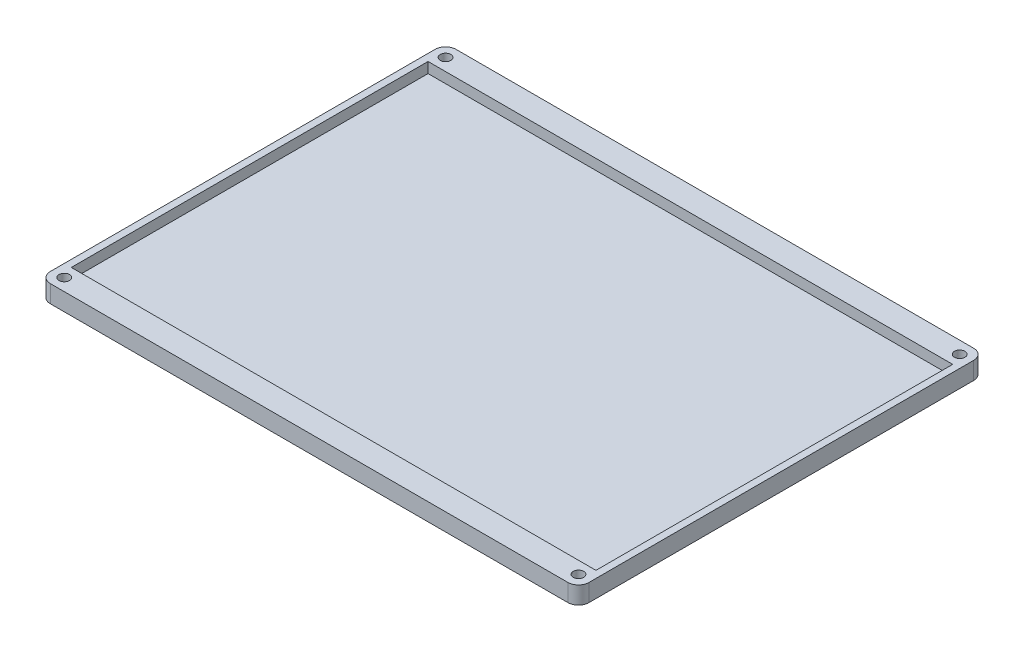
ISO-10303-21;
HEADER;
FILE_DESCRIPTION(('STEP AP214'),'2;1');
FILE_NAME('part.step','',(''),(''),'','','');
FILE_SCHEMA(('AUTOMOTIVE_DESIGN { 1 0 10303 214 1 1 1 1 }'));
ENDSEC;
DATA;
#1=APPLICATION_CONTEXT('core data for automotive mechanical design processes');
#2=APPLICATION_PROTOCOL_DEFINITION('international standard','automotive_design',2000,#1);
#3=PRODUCT_CONTEXT('',#1,'mechanical');
#4=PRODUCT('Part','Part','',(#3));
#5=PRODUCT_RELATED_PRODUCT_CATEGORY('part','',(#4));
#6=PRODUCT_DEFINITION_FORMATION('','',#4);
#7=PRODUCT_DEFINITION_CONTEXT('part definition',#1,'design');
#8=PRODUCT_DEFINITION('design','',#6,#7);
#9=PRODUCT_DEFINITION_SHAPE('','',#8);
#10=(LENGTH_UNIT() NAMED_UNIT(*) SI_UNIT(.MILLI.,.METRE.));
#11=(NAMED_UNIT(*) PLANE_ANGLE_UNIT() SI_UNIT($,.RADIAN.));
#12=(NAMED_UNIT(*) SI_UNIT($,.STERADIAN.) SOLID_ANGLE_UNIT());
#13=UNCERTAINTY_MEASURE_WITH_UNIT(LENGTH_MEASURE(1.E-05),#10,'distance_accuracy_value','');
#14=(GEOMETRIC_REPRESENTATION_CONTEXT(3) GLOBAL_UNCERTAINTY_ASSIGNED_CONTEXT((#13)) GLOBAL_UNIT_ASSIGNED_CONTEXT((#10,
#11,#12)) REPRESENTATION_CONTEXT('',''));
#15=CARTESIAN_POINT('',(0.,0.,0.));
#16=DIRECTION('',(0.,0.,1.));
#17=DIRECTION('',(1.,0.,0.));
#18=AXIS2_PLACEMENT_3D('',#15,#16,#17);
#19=CARTESIAN_POINT('',(74.,5.,-55.));
#20=DIRECTION('',(0.,1.,0.));
#21=DIRECTION('',(0.,0.,1.));
#22=AXIS2_PLACEMENT_3D('',#19,#20,#21);
#23=CYLINDRICAL_SURFACE('',#22,3.);
#24=DIRECTION('',(0.,1.,0.));
#25=VECTOR('',#24,1.);
#26=CARTESIAN_POINT('',(77.,5.,-55.));
#27=LINE('',#26,#25);
#28=CARTESIAN_POINT('',(77.,0.,-55.));
#29=VERTEX_POINT('',#28);
#30=CARTESIAN_POINT('',(77.,5.,-55.));
#31=VERTEX_POINT('',#30);
#32=EDGE_CURVE('E253',#29,#31,#27,.T.);
#33=ORIENTED_EDGE('',*,*,#32,.F.);
#34=CARTESIAN_POINT('',(74.,0.,-55.));
#35=DIRECTION('',(0.,1.,0.));
#36=DIRECTION('',(0.,0.,1.));
#37=AXIS2_PLACEMENT_3D('',#34,#35,#36);
#38=CIRCLE('',#37,3.);
#39=CARTESIAN_POINT('',(74.,0.,-58.));
#40=VERTEX_POINT('',#39);
#41=EDGE_CURVE('E47',#40,#29,#38,.F.);
#42=ORIENTED_EDGE('',*,*,#41,.F.);
#43=DIRECTION('',(0.,1.,0.));
#44=VECTOR('',#43,1.);
#45=CARTESIAN_POINT('',(74.,5.,-58.));
#46=LINE('',#45,#44);
#47=CARTESIAN_POINT('',(74.,5.,-58.));
#48=VERTEX_POINT('',#47);
#49=EDGE_CURVE('E257',#48,#40,#46,.F.);
#50=ORIENTED_EDGE('',*,*,#49,.F.);
#51=CARTESIAN_POINT('',(74.,5.,-55.));
#52=DIRECTION('',(0.,1.,0.));
#53=DIRECTION('',(0.,0.,1.));
#54=AXIS2_PLACEMENT_3D('',#51,#52,#53);
#55=CIRCLE('',#54,3.);
#56=EDGE_CURVE('E11',#31,#48,#55,.T.);
#57=ORIENTED_EDGE('',*,*,#56,.F.);
#58=EDGE_LOOP('',(#33,#42,#50,#57));
#59=FACE_BOUND('',#58,.T.);
#60=ADVANCED_FACE('F39',(#59),#23,.T.);
#61=CARTESIAN_POINT('',(-74.,5.,-55.));
#62=DIRECTION('',(0.,1.,0.));
#63=DIRECTION('',(0.,0.,1.));
#64=AXIS2_PLACEMENT_3D('',#61,#62,#63);
#65=CYLINDRICAL_SURFACE('',#64,3.);
#66=DIRECTION('',(0.,1.,0.));
#67=VECTOR('',#66,1.);
#68=CARTESIAN_POINT('',(-74.,5.,-58.));
#69=LINE('',#68,#67);
#70=CARTESIAN_POINT('',(-74.,0.,-58.));
#71=VERTEX_POINT('',#70);
#72=CARTESIAN_POINT('',(-74.,5.,-58.));
#73=VERTEX_POINT('',#72);
#74=EDGE_CURVE('E238',#71,#73,#69,.T.);
#75=ORIENTED_EDGE('',*,*,#74,.F.);
#76=CARTESIAN_POINT('',(-74.,0.,-55.));
#77=DIRECTION('',(0.,1.,0.));
#78=DIRECTION('',(0.,0.,1.));
#79=AXIS2_PLACEMENT_3D('',#76,#77,#78);
#80=CIRCLE('',#79,3.);
#81=CARTESIAN_POINT('',(-77.,0.,-55.));
#82=VERTEX_POINT('',#81);
#83=EDGE_CURVE('E246',#82,#71,#80,.F.);
#84=ORIENTED_EDGE('',*,*,#83,.F.);
#85=DIRECTION('',(0.,1.,0.));
#86=VECTOR('',#85,1.);
#87=CARTESIAN_POINT('',(-77.,5.,-55.));
#88=LINE('',#87,#86);
#89=CARTESIAN_POINT('',(-77.,5.,-55.));
#90=VERTEX_POINT('',#89);
#91=EDGE_CURVE('E242',#90,#82,#88,.F.);
#92=ORIENTED_EDGE('',*,*,#91,.F.);
#93=CARTESIAN_POINT('',(-74.,5.,-55.));
#94=DIRECTION('',(0.,1.,0.));
#95=DIRECTION('',(0.,0.,1.));
#96=AXIS2_PLACEMENT_3D('',#93,#94,#95);
#97=CIRCLE('',#96,3.);
#98=EDGE_CURVE('E250',#73,#90,#97,.T.);
#99=ORIENTED_EDGE('',*,*,#98,.F.);
#100=EDGE_LOOP('',(#75,#84,#92,#99));
#101=FACE_BOUND('',#100,.T.);
#102=ADVANCED_FACE('F289',(#101),#65,.T.);
#103=CARTESIAN_POINT('',(-74.,5.,55.));
#104=DIRECTION('',(0.,-1.,0.));
#105=DIRECTION('',(0.,0.,-1.));
#106=AXIS2_PLACEMENT_3D('',#103,#104,#105);
#107=CYLINDRICAL_SURFACE('',#106,3.);
#108=DIRECTION('',(0.,-1.,0.));
#109=VECTOR('',#108,1.);
#110=CARTESIAN_POINT('',(-74.,5.,58.));
#111=LINE('',#110,#109);
#112=CARTESIAN_POINT('',(-74.,5.,58.));
#113=VERTEX_POINT('',#112);
#114=CARTESIAN_POINT('',(-74.,0.,58.));
#115=VERTEX_POINT('',#114);
#116=EDGE_CURVE('E223',#113,#115,#111,.T.);
#117=ORIENTED_EDGE('',*,*,#116,.F.);
#118=CARTESIAN_POINT('',(-74.,5.,55.));
#119=DIRECTION('',(0.,1.,0.));
#120=DIRECTION('',(0.,0.,1.));
#121=AXIS2_PLACEMENT_3D('',#118,#119,#120);
#122=CIRCLE('',#121,3.);
#123=CARTESIAN_POINT('',(-77.,5.,55.));
#124=VERTEX_POINT('',#123);
#125=EDGE_CURVE('E231',#124,#113,#122,.T.);
#126=ORIENTED_EDGE('',*,*,#125,.F.);
#127=DIRECTION('',(0.,-1.,0.));
#128=VECTOR('',#127,1.);
#129=CARTESIAN_POINT('',(-77.,5.,55.));
#130=LINE('',#129,#128);
#131=CARTESIAN_POINT('',(-77.,0.,55.));
#132=VERTEX_POINT('',#131);
#133=EDGE_CURVE('E227',#132,#124,#130,.F.);
#134=ORIENTED_EDGE('',*,*,#133,.F.);
#135=CARTESIAN_POINT('',(-74.,0.,55.));
#136=DIRECTION('',(0.,1.,0.));
#137=DIRECTION('',(0.,0.,1.));
#138=AXIS2_PLACEMENT_3D('',#135,#136,#137);
#139=CIRCLE('',#138,3.);
#140=EDGE_CURVE('E234',#115,#132,#139,.F.);
#141=ORIENTED_EDGE('',*,*,#140,.F.);
#142=EDGE_LOOP('',(#117,#126,#134,#141));
#143=FACE_BOUND('',#142,.T.);
#144=ADVANCED_FACE('F281',(#143),#107,.T.);
#145=CARTESIAN_POINT('',(74.,5.,55.));
#146=DIRECTION('',(0.,-1.,0.));
#147=DIRECTION('',(0.,0.,-1.));
#148=AXIS2_PLACEMENT_3D('',#145,#146,#147);
#149=CYLINDRICAL_SURFACE('',#148,3.);
#150=DIRECTION('',(0.,-1.,0.));
#151=VECTOR('',#150,1.);
#152=CARTESIAN_POINT('',(77.,5.,55.));
#153=LINE('',#152,#151);
#154=CARTESIAN_POINT('',(77.,5.,55.));
#155=VERTEX_POINT('',#154);
#156=CARTESIAN_POINT('',(77.,0.,55.));
#157=VERTEX_POINT('',#156);
#158=EDGE_CURVE('E197',#155,#157,#153,.T.);
#159=ORIENTED_EDGE('',*,*,#158,.F.);
#160=CARTESIAN_POINT('',(74.,5.,55.));
#161=DIRECTION('',(0.,1.,0.));
#162=DIRECTION('',(0.,0.,1.));
#163=AXIS2_PLACEMENT_3D('',#160,#161,#162);
#164=CIRCLE('',#163,3.);
#165=CARTESIAN_POINT('',(73.9999999999999,5.,58.));
#166=VERTEX_POINT('',#165);
#167=EDGE_CURVE('E216',#166,#155,#164,.T.);
#168=ORIENTED_EDGE('',*,*,#167,.F.);
#169=DIRECTION('',(0.,-1.,0.));
#170=VECTOR('',#169,1.);
#171=CARTESIAN_POINT('',(74.,5.,58.));
#172=LINE('',#171,#170);
#173=CARTESIAN_POINT('',(73.9999999999999,0.,58.));
#174=VERTEX_POINT('',#173);
#175=EDGE_CURVE('E212',#174,#166,#172,.F.);
#176=ORIENTED_EDGE('',*,*,#175,.F.);
#177=CARTESIAN_POINT('',(74.,0.,55.));
#178=DIRECTION('',(0.,1.,0.));
#179=DIRECTION('',(0.,0.,1.));
#180=AXIS2_PLACEMENT_3D('',#177,#178,#179);
#181=CIRCLE('',#180,3.);
#182=EDGE_CURVE('E219',#157,#174,#181,.F.);
#183=ORIENTED_EDGE('',*,*,#182,.F.);
#184=EDGE_LOOP('',(#159,#168,#176,#183));
#185=FACE_BOUND('',#184,.T.);
#186=ADVANCED_FACE('F270',(#185),#149,.T.);
#187=CARTESIAN_POINT('',(77.,5.,-58.));
#188=DIRECTION('',(-1.,0.,0.));
#189=DIRECTION('',(0.,0.,1.));
#190=AXIS2_PLACEMENT_3D('',#187,#188,#189);
#191=PLANE('',#190);
#192=DIRECTION('',(0.,0.,-1.));
#193=VECTOR('',#192,1.);
#194=CARTESIAN_POINT('',(77.,0.,-58.));
#195=LINE('',#194,#193);
#196=EDGE_CURVE('E178',#157,#29,#195,.T.);
#197=ORIENTED_EDGE('',*,*,#196,.T.);
#198=ORIENTED_EDGE('',*,*,#32,.T.);
#199=DIRECTION('',(0.,0.,-1.));
#200=VECTOR('',#199,1.);
#201=CARTESIAN_POINT('',(77.,5.,-58.));
#202=LINE('',#201,#200);
#203=EDGE_CURVE('E184',#155,#31,#202,.T.);
#204=ORIENTED_EDGE('',*,*,#203,.F.);
#205=ORIENTED_EDGE('',*,*,#158,.T.);
#206=EDGE_LOOP('',(#197,#198,#204,#205));
#207=FACE_BOUND('',#206,.T.);
#208=ADVANCED_FACE('F266',(#207),#191,.F.);
#209=CARTESIAN_POINT('',(-77.,5.,-58.));
#210=DIRECTION('',(0.,0.,1.));
#211=DIRECTION('',(1.,0.,0.));
#212=AXIS2_PLACEMENT_3D('',#209,#210,#211);
#213=PLANE('',#212);
#214=DIRECTION('',(-1.,0.,0.));
#215=VECTOR('',#214,1.);
#216=CARTESIAN_POINT('',(-77.,5.,-58.));
#217=LINE('',#216,#215);
#218=EDGE_CURVE('E187',#48,#73,#217,.T.);
#219=ORIENTED_EDGE('',*,*,#218,.F.);
#220=ORIENTED_EDGE('',*,*,#49,.T.);
#221=DIRECTION('',(-1.,0.,0.));
#222=VECTOR('',#221,1.);
#223=CARTESIAN_POINT('',(-77.,0.,-58.));
#224=LINE('',#223,#222);
#225=EDGE_CURVE('E201',#40,#71,#224,.T.);
#226=ORIENTED_EDGE('',*,*,#225,.T.);
#227=ORIENTED_EDGE('',*,*,#74,.T.);
#228=EDGE_LOOP('',(#219,#220,#226,#227));
#229=FACE_BOUND('',#228,.T.);
#230=ADVANCED_FACE('F292',(#229),#213,.F.);
#231=CARTESIAN_POINT('',(-77.,5.,-58.));
#232=DIRECTION('',(1.,0.,0.));
#233=DIRECTION('',(0.,0.,-1.));
#234=AXIS2_PLACEMENT_3D('',#231,#232,#233);
#235=PLANE('',#234);
#236=DIRECTION('',(0.,0.,1.));
#237=VECTOR('',#236,1.);
#238=CARTESIAN_POINT('',(-77.,5.,-58.));
#239=LINE('',#238,#237);
#240=EDGE_CURVE('E191',#90,#124,#239,.T.);
#241=ORIENTED_EDGE('',*,*,#240,.F.);
#242=ORIENTED_EDGE('',*,*,#91,.T.);
#243=DIRECTION('',(0.,0.,1.));
#244=VECTOR('',#243,1.);
#245=CARTESIAN_POINT('',(-77.,0.,-58.));
#246=LINE('',#245,#244);
#247=EDGE_CURVE('E204',#82,#132,#246,.T.);
#248=ORIENTED_EDGE('',*,*,#247,.T.);
#249=ORIENTED_EDGE('',*,*,#133,.T.);
#250=EDGE_LOOP('',(#241,#242,#248,#249));
#251=FACE_BOUND('',#250,.T.);
#252=ADVANCED_FACE('F284',(#251),#235,.F.);
#253=CARTESIAN_POINT('',(-77.,5.,58.));
#254=DIRECTION('',(0.,0.,-1.));
#255=DIRECTION('',(-1.,0.,0.));
#256=AXIS2_PLACEMENT_3D('',#253,#254,#255);
#257=PLANE('',#256);
#258=DIRECTION('',(1.,0.,0.));
#259=VECTOR('',#258,1.);
#260=CARTESIAN_POINT('',(-77.,5.,58.));
#261=LINE('',#260,#259);
#262=EDGE_CURVE('E194',#113,#166,#261,.T.);
#263=ORIENTED_EDGE('',*,*,#262,.F.);
#264=ORIENTED_EDGE('',*,*,#116,.T.);
#265=DIRECTION('',(1.,0.,0.));
#266=VECTOR('',#265,1.);
#267=CARTESIAN_POINT('',(-77.,0.,58.));
#268=LINE('',#267,#266);
#269=EDGE_CURVE('E188',#115,#174,#268,.T.);
#270=ORIENTED_EDGE('',*,*,#269,.T.);
#271=ORIENTED_EDGE('',*,*,#175,.T.);
#272=EDGE_LOOP('',(#263,#264,#270,#271));
#273=FACE_BOUND('',#272,.T.);
#274=ADVANCED_FACE('F277',(#273),#257,.F.);
#275=CARTESIAN_POINT('',(0.,5.,0.));
#276=DIRECTION('',(0.,1.,0.));
#277=DIRECTION('',(0.,0.,1.));
#278=AXIS2_PLACEMENT_3D('',#275,#276,#277);
#279=PLANE('',#278);
#280=CARTESIAN_POINT('',(-73.5,5.,54.5));
#281=DIRECTION('',(0.,1.,0.));
#282=DIRECTION('',(0.,0.,1.));
#283=AXIS2_PLACEMENT_3D('',#280,#281,#282);
#284=CIRCLE('',#283,1.5);
#285=CARTESIAN_POINT('',(-73.5,5.,56.));
#286=VERTEX_POINT('',#285);
#287=EDGE_CURVE('E463',#286,#286,#284,.T.);
#288=ORIENTED_EDGE('',*,*,#287,.F.);
#289=EDGE_LOOP('',(#288));
#290=FACE_BOUND('',#289,.T.);
#291=CARTESIAN_POINT('',(73.5,5.,54.5));
#292=DIRECTION('',(0.,1.,0.));
#293=DIRECTION('',(0.,0.,1.));
#294=AXIS2_PLACEMENT_3D('',#291,#292,#293);
#295=CIRCLE('',#294,1.5);
#296=CARTESIAN_POINT('',(73.5,5.,56.));
#297=VERTEX_POINT('',#296);
#298=EDGE_CURVE('E467',#297,#297,#295,.T.);
#299=ORIENTED_EDGE('',*,*,#298,.F.);
#300=EDGE_LOOP('',(#299));
#301=FACE_BOUND('',#300,.T.);
#302=CARTESIAN_POINT('',(73.5,5.,-54.5));
#303=DIRECTION('',(0.,1.,0.));
#304=DIRECTION('',(0.,0.,1.));
#305=AXIS2_PLACEMENT_3D('',#302,#303,#304);
#306=CIRCLE('',#305,1.5);
#307=CARTESIAN_POINT('',(73.5,5.,-53.));
#308=VERTEX_POINT('',#307);
#309=EDGE_CURVE('E481',#308,#308,#306,.T.);
#310=ORIENTED_EDGE('',*,*,#309,.F.);
#311=EDGE_LOOP('',(#310));
#312=FACE_BOUND('',#311,.T.);
#313=CARTESIAN_POINT('',(-73.5,5.,-54.5));
#314=DIRECTION('',(0.,1.,0.));
#315=DIRECTION('',(0.,0.,1.));
#316=AXIS2_PLACEMENT_3D('',#313,#314,#315);
#317=CIRCLE('',#316,1.5);
#318=CARTESIAN_POINT('',(-73.5,5.,-53.));
#319=VERTEX_POINT('',#318);
#320=EDGE_CURVE('E159',#319,#319,#317,.T.);
#321=ORIENTED_EDGE('',*,*,#320,.F.);
#322=EDGE_LOOP('',(#321));
#323=FACE_BOUND('',#322,.T.);
#324=DIRECTION('',(0.,0.,1.));
#325=VECTOR('',#324,1.);
#326=CARTESIAN_POINT('',(-75.,5.,51.));
#327=LINE('',#326,#325);
#328=CARTESIAN_POINT('',(-75.,5.,-51.));
#329=VERTEX_POINT('',#328);
#330=CARTESIAN_POINT('',(-75.,5.,51.));
#331=VERTEX_POINT('',#330);
#332=EDGE_CURVE('E132',#329,#331,#327,.T.);
#333=ORIENTED_EDGE('',*,*,#332,.F.);
#334=DIRECTION('',(-1.,0.,0.));
#335=VECTOR('',#334,1.);
#336=CARTESIAN_POINT('',(75.,5.,-51.));
#337=LINE('',#336,#335);
#338=CARTESIAN_POINT('',(75.,5.,-51.));
#339=VERTEX_POINT('',#338);
#340=EDGE_CURVE('E152',#339,#329,#337,.T.);
#341=ORIENTED_EDGE('',*,*,#340,.F.);
#342=DIRECTION('',(0.,0.,-1.));
#343=VECTOR('',#342,1.);
#344=CARTESIAN_POINT('',(75.,5.,51.));
#345=LINE('',#344,#343);
#346=CARTESIAN_POINT('',(75.,5.,51.));
#347=VERTEX_POINT('',#346);
#348=EDGE_CURVE('E156',#347,#339,#345,.T.);
#349=ORIENTED_EDGE('',*,*,#348,.F.);
#350=DIRECTION('',(1.,0.,0.));
#351=VECTOR('',#350,1.);
#352=CARTESIAN_POINT('',(75.,5.,51.));
#353=LINE('',#352,#351);
#354=EDGE_CURVE('E168',#331,#347,#353,.T.);
#355=ORIENTED_EDGE('',*,*,#354,.F.);
#356=EDGE_LOOP('',(#333,#341,#349,#355));
#357=FACE_BOUND('',#356,.T.);
#358=ORIENTED_EDGE('',*,*,#203,.T.);
#359=ORIENTED_EDGE('',*,*,#56,.T.);
#360=ORIENTED_EDGE('',*,*,#218,.T.);
#361=ORIENTED_EDGE('',*,*,#98,.T.);
#362=ORIENTED_EDGE('',*,*,#240,.T.);
#363=ORIENTED_EDGE('',*,*,#125,.T.);
#364=ORIENTED_EDGE('',*,*,#262,.T.);
#365=ORIENTED_EDGE('',*,*,#167,.T.);
#366=EDGE_LOOP('',(#358,#359,#360,#361,#362,#363,#364,#365));
#367=FACE_BOUND('',#366,.T.);
#368=ADVANCED_FACE('F293',(#290,#301,#312,#323,#357,#367),#279,.T.);
#369=CARTESIAN_POINT('',(0.,0.,0.));
#370=DIRECTION('',(0.,1.,0.));
#371=DIRECTION('',(0.,0.,1.));
#372=AXIS2_PLACEMENT_3D('',#369,#370,#371);
#373=PLANE('',#372);
#374=CARTESIAN_POINT('',(-73.5,0.,54.5));
#375=DIRECTION('',(0.,1.,0.));
#376=DIRECTION('',(0.,0.,1.));
#377=AXIS2_PLACEMENT_3D('',#374,#375,#376);
#378=CIRCLE('',#377,1.5);
#379=CARTESIAN_POINT('',(-73.5,0.,56.));
#380=VERTEX_POINT('',#379);
#381=EDGE_CURVE('E461',#380,#380,#378,.T.);
#382=ORIENTED_EDGE('',*,*,#381,.T.);
#383=EDGE_LOOP('',(#382));
#384=FACE_BOUND('',#383,.T.);
#385=CARTESIAN_POINT('',(73.5,0.,54.5));
#386=DIRECTION('',(0.,1.,0.));
#387=DIRECTION('',(0.,0.,1.));
#388=AXIS2_PLACEMENT_3D('',#385,#386,#387);
#389=CIRCLE('',#388,1.5);
#390=CARTESIAN_POINT('',(73.5,0.,56.));
#391=VERTEX_POINT('',#390);
#392=EDGE_CURVE('E487',#391,#391,#389,.T.);
#393=ORIENTED_EDGE('',*,*,#392,.T.);
#394=EDGE_LOOP('',(#393));
#395=FACE_BOUND('',#394,.T.);
#396=CARTESIAN_POINT('',(73.5,0.,-54.5));
#397=DIRECTION('',(0.,1.,0.));
#398=DIRECTION('',(0.,0.,1.));
#399=AXIS2_PLACEMENT_3D('',#396,#397,#398);
#400=CIRCLE('',#399,1.5);
#401=CARTESIAN_POINT('',(73.5,0.,-53.));
#402=VERTEX_POINT('',#401);
#403=EDGE_CURVE('E476',#402,#402,#400,.T.);
#404=ORIENTED_EDGE('',*,*,#403,.T.);
#405=EDGE_LOOP('',(#404));
#406=FACE_BOUND('',#405,.T.);
#407=CARTESIAN_POINT('',(-73.5,0.,-54.5));
#408=DIRECTION('',(0.,1.,0.));
#409=DIRECTION('',(0.,0.,1.));
#410=AXIS2_PLACEMENT_3D('',#407,#408,#409);
#411=CIRCLE('',#410,1.5);
#412=CARTESIAN_POINT('',(-73.5,0.,-53.));
#413=VERTEX_POINT('',#412);
#414=EDGE_CURVE('E169',#413,#413,#411,.T.);
#415=ORIENTED_EDGE('',*,*,#414,.T.);
#416=EDGE_LOOP('',(#415));
#417=FACE_BOUND('',#416,.T.);
#418=ORIENTED_EDGE('',*,*,#225,.F.);
#419=ORIENTED_EDGE('',*,*,#41,.T.);
#420=ORIENTED_EDGE('',*,*,#196,.F.);
#421=ORIENTED_EDGE('',*,*,#182,.T.);
#422=ORIENTED_EDGE('',*,*,#269,.F.);
#423=ORIENTED_EDGE('',*,*,#140,.T.);
#424=ORIENTED_EDGE('',*,*,#247,.F.);
#425=ORIENTED_EDGE('',*,*,#83,.T.);
#426=EDGE_LOOP('',(#418,#419,#420,#421,#422,#423,#424,#425));
#427=FACE_BOUND('',#426,.T.);
#428=ADVANCED_FACE('F263',(#384,#395,#406,#417,#427),#373,.F.);
#429=CARTESIAN_POINT('',(-75.,2.,51.));
#430=DIRECTION('',(-1.,0.,0.));
#431=DIRECTION('',(0.,0.,1.));
#432=AXIS2_PLACEMENT_3D('',#429,#430,#431);
#433=PLANE('',#432);
#434=ORIENTED_EDGE('',*,*,#332,.T.);
#435=DIRECTION('',(0.,1.,0.));
#436=VECTOR('',#435,1.);
#437=CARTESIAN_POINT('',(-75.,2.,51.));
#438=LINE('',#437,#436);
#439=CARTESIAN_POINT('',(-75.,2.,51.));
#440=VERTEX_POINT('',#439);
#441=EDGE_CURVE('E125',#440,#331,#438,.T.);
#442=ORIENTED_EDGE('',*,*,#441,.F.);
#443=DIRECTION('',(0.,0.,1.));
#444=VECTOR('',#443,1.);
#445=CARTESIAN_POINT('',(-75.,2.,51.));
#446=LINE('',#445,#444);
#447=CARTESIAN_POINT('',(-75.,2.,-51.));
#448=VERTEX_POINT('',#447);
#449=EDGE_CURVE('E129',#448,#440,#446,.T.);
#450=ORIENTED_EDGE('',*,*,#449,.F.);
#451=DIRECTION('',(0.,1.,0.));
#452=VECTOR('',#451,1.);
#453=CARTESIAN_POINT('',(-75.,2.,-51.));
#454=LINE('',#453,#452);
#455=EDGE_CURVE('E175',#448,#329,#454,.T.);
#456=ORIENTED_EDGE('',*,*,#455,.T.);
#457=EDGE_LOOP('',(#434,#442,#450,#456));
#458=FACE_BOUND('',#457,.T.);
#459=ADVANCED_FACE('F127',(#458),#433,.F.);
#460=CARTESIAN_POINT('',(75.,2.,-51.));
#461=DIRECTION('',(0.,0.,-1.));
#462=DIRECTION('',(-1.,0.,0.));
#463=AXIS2_PLACEMENT_3D('',#460,#461,#462);
#464=PLANE('',#463);
#465=ORIENTED_EDGE('',*,*,#340,.T.);
#466=ORIENTED_EDGE('',*,*,#455,.F.);
#467=DIRECTION('',(-1.,0.,0.));
#468=VECTOR('',#467,1.);
#469=CARTESIAN_POINT('',(75.,2.,-51.));
#470=LINE('',#469,#468);
#471=CARTESIAN_POINT('',(75.,2.,-51.));
#472=VERTEX_POINT('',#471);
#473=EDGE_CURVE('E138',#472,#448,#470,.T.);
#474=ORIENTED_EDGE('',*,*,#473,.F.);
#475=DIRECTION('',(0.,1.,0.));
#476=VECTOR('',#475,1.);
#477=CARTESIAN_POINT('',(75.,2.,-51.));
#478=LINE('',#477,#476);
#479=EDGE_CURVE('E179',#472,#339,#478,.T.);
#480=ORIENTED_EDGE('',*,*,#479,.T.);
#481=EDGE_LOOP('',(#465,#466,#474,#480));
#482=FACE_BOUND('',#481,.T.);
#483=ADVANCED_FACE('F375',(#482),#464,.F.);
#484=CARTESIAN_POINT('',(75.,2.,51.));
#485=DIRECTION('',(1.,0.,0.));
#486=DIRECTION('',(0.,0.,-1.));
#487=AXIS2_PLACEMENT_3D('',#484,#485,#486);
#488=PLANE('',#487);
#489=ORIENTED_EDGE('',*,*,#348,.T.);
#490=ORIENTED_EDGE('',*,*,#479,.F.);
#491=DIRECTION('',(0.,0.,-1.));
#492=VECTOR('',#491,1.);
#493=CARTESIAN_POINT('',(75.,2.,51.));
#494=LINE('',#493,#492);
#495=CARTESIAN_POINT('',(75.,2.,51.));
#496=VERTEX_POINT('',#495);
#497=EDGE_CURVE('E147',#496,#472,#494,.T.);
#498=ORIENTED_EDGE('',*,*,#497,.F.);
#499=DIRECTION('',(0.,1.,0.));
#500=VECTOR('',#499,1.);
#501=CARTESIAN_POINT('',(75.,2.,51.));
#502=LINE('',#501,#500);
#503=EDGE_CURVE('E137',#496,#347,#502,.T.);
#504=ORIENTED_EDGE('',*,*,#503,.T.);
#505=EDGE_LOOP('',(#489,#490,#498,#504));
#506=FACE_BOUND('',#505,.T.);
#507=ADVANCED_FACE('F380',(#506),#488,.F.);
#508=CARTESIAN_POINT('',(75.,2.,51.));
#509=DIRECTION('',(0.,0.,1.));
#510=DIRECTION('',(1.,0.,0.));
#511=AXIS2_PLACEMENT_3D('',#508,#509,#510);
#512=PLANE('',#511);
#513=ORIENTED_EDGE('',*,*,#354,.T.);
#514=ORIENTED_EDGE('',*,*,#503,.F.);
#515=DIRECTION('',(1.,0.,0.));
#516=VECTOR('',#515,1.);
#517=CARTESIAN_POINT('',(75.,2.,51.));
#518=LINE('',#517,#516);
#519=EDGE_CURVE('E141',#440,#496,#518,.T.);
#520=ORIENTED_EDGE('',*,*,#519,.F.);
#521=ORIENTED_EDGE('',*,*,#441,.T.);
#522=EDGE_LOOP('',(#513,#514,#520,#521));
#523=FACE_BOUND('',#522,.T.);
#524=ADVANCED_FACE('F142',(#523),#512,.F.);
#525=CARTESIAN_POINT('',(0.,2.,0.));
#526=DIRECTION('',(0.,1.,0.));
#527=DIRECTION('',(0.,0.,1.));
#528=AXIS2_PLACEMENT_3D('',#525,#526,#527);
#529=PLANE('',#528);
#530=ORIENTED_EDGE('',*,*,#449,.T.);
#531=ORIENTED_EDGE('',*,*,#519,.T.);
#532=ORIENTED_EDGE('',*,*,#497,.T.);
#533=ORIENTED_EDGE('',*,*,#473,.T.);
#534=EDGE_LOOP('',(#530,#531,#532,#533));
#535=FACE_BOUND('',#534,.T.);
#536=ADVANCED_FACE('F149',(#535),#529,.T.);
#537=CARTESIAN_POINT('',(-73.5,0.,-54.5));
#538=DIRECTION('',(0.,1.,0.));
#539=DIRECTION('',(0.,0.,1.));
#540=AXIS2_PLACEMENT_3D('',#537,#538,#539);
#541=CYLINDRICAL_SURFACE('',#540,1.5);
#542=ORIENTED_EDGE('',*,*,#414,.F.);
#543=EDGE_LOOP('',(#542));
#544=FACE_BOUND('',#543,.T.);
#545=ORIENTED_EDGE('',*,*,#320,.T.);
#546=EDGE_LOOP('',(#545));
#547=FACE_BOUND('',#546,.T.);
#548=ADVANCED_FACE('F401',(#544,#547),#541,.F.);
#549=CARTESIAN_POINT('',(73.5,0.,-54.5));
#550=DIRECTION('',(0.,1.,0.));
#551=DIRECTION('',(0.,0.,1.));
#552=AXIS2_PLACEMENT_3D('',#549,#550,#551);
#553=CYLINDRICAL_SURFACE('',#552,1.5);
#554=ORIENTED_EDGE('',*,*,#403,.F.);
#555=EDGE_LOOP('',(#554));
#556=FACE_BOUND('',#555,.T.);
#557=ORIENTED_EDGE('',*,*,#309,.T.);
#558=EDGE_LOOP('',(#557));
#559=FACE_BOUND('',#558,.T.);
#560=ADVANCED_FACE('F408',(#556,#559),#553,.F.);
#561=CARTESIAN_POINT('',(73.5,0.,54.5));
#562=DIRECTION('',(0.,1.,0.));
#563=DIRECTION('',(0.,0.,1.));
#564=AXIS2_PLACEMENT_3D('',#561,#562,#563);
#565=CYLINDRICAL_SURFACE('',#564,1.5);
#566=ORIENTED_EDGE('',*,*,#392,.F.);
#567=EDGE_LOOP('',(#566));
#568=FACE_BOUND('',#567,.T.);
#569=ORIENTED_EDGE('',*,*,#298,.T.);
#570=EDGE_LOOP('',(#569));
#571=FACE_BOUND('',#570,.T.);
#572=ADVANCED_FACE('F416',(#568,#571),#565,.F.);
#573=CARTESIAN_POINT('',(-73.5,0.,54.5));
#574=DIRECTION('',(0.,1.,0.));
#575=DIRECTION('',(0.,0.,1.));
#576=AXIS2_PLACEMENT_3D('',#573,#574,#575);
#577=CYLINDRICAL_SURFACE('',#576,1.5);
#578=ORIENTED_EDGE('',*,*,#381,.F.);
#579=EDGE_LOOP('',(#578));
#580=FACE_BOUND('',#579,.T.);
#581=ORIENTED_EDGE('',*,*,#287,.T.);
#582=EDGE_LOOP('',(#581));
#583=FACE_BOUND('',#582,.T.);
#584=ADVANCED_FACE('F424',(#580,#583),#577,.F.);
#585=CLOSED_SHELL('',(#60,#102,#144,#186,#208,#230,#252,#274,#368,#428,#459,#483,#507,#524,#536,
#548,#560,#572,#584));
#586=MANIFOLD_SOLID_BREP('B2',#585);
#587=ADVANCED_BREP_SHAPE_REPRESENTATION('',(#18,#586),#14);
#588=SHAPE_DEFINITION_REPRESENTATION(#9,#587);
ENDSEC;
END-ISO-10303-21;
